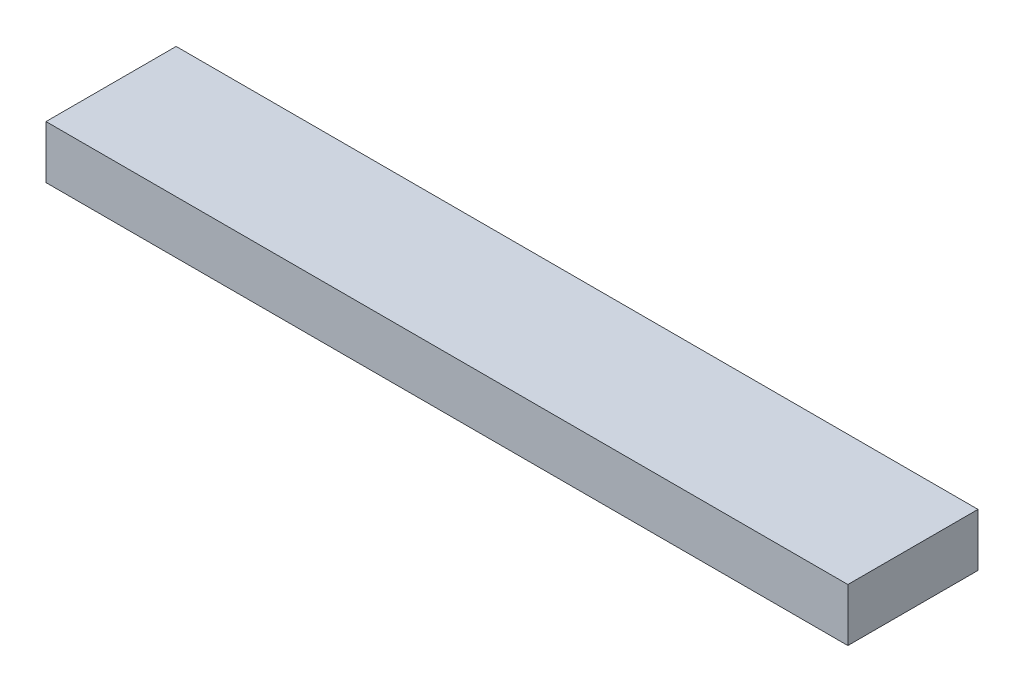
ISO-10303-21;
HEADER;
FILE_DESCRIPTION(('STEP AP214'),'2;1');
FILE_NAME('part.step','',(''),(''),'','','');
FILE_SCHEMA(('AUTOMOTIVE_DESIGN { 1 0 10303 214 1 1 1 1 }'));
ENDSEC;
DATA;
#1=APPLICATION_CONTEXT('core data for automotive mechanical design processes');
#2=APPLICATION_PROTOCOL_DEFINITION('international standard','automotive_design',2000,#1);
#3=PRODUCT_CONTEXT('',#1,'mechanical');
#4=PRODUCT('Part','Part','',(#3));
#5=PRODUCT_RELATED_PRODUCT_CATEGORY('part','',(#4));
#6=PRODUCT_DEFINITION_FORMATION('','',#4);
#7=PRODUCT_DEFINITION_CONTEXT('part definition',#1,'design');
#8=PRODUCT_DEFINITION('design','',#6,#7);
#9=PRODUCT_DEFINITION_SHAPE('','',#8);
#10=(LENGTH_UNIT() NAMED_UNIT(*) SI_UNIT(.MILLI.,.METRE.));
#11=(NAMED_UNIT(*) PLANE_ANGLE_UNIT() SI_UNIT($,.RADIAN.));
#12=(NAMED_UNIT(*) SI_UNIT($,.STERADIAN.) SOLID_ANGLE_UNIT());
#13=UNCERTAINTY_MEASURE_WITH_UNIT(LENGTH_MEASURE(1.E-05),#10,'distance_accuracy_value','');
#14=(GEOMETRIC_REPRESENTATION_CONTEXT(3) GLOBAL_UNCERTAINTY_ASSIGNED_CONTEXT((#13)) GLOBAL_UNIT_ASSIGNED_CONTEXT((#10,
#11,#12)) REPRESENTATION_CONTEXT('',''));
#15=CARTESIAN_POINT('',(0.,0.,0.));
#16=DIRECTION('',(0.,0.,1.));
#17=DIRECTION('',(1.,0.,0.));
#18=AXIS2_PLACEMENT_3D('',#15,#16,#17);
#19=CARTESIAN_POINT('',(23.875,-3.15,-3.875));
#20=DIRECTION('',(1.,0.,0.));
#21=DIRECTION('',(0.,0.,-1.));
#22=AXIS2_PLACEMENT_3D('',#19,#20,#21);
#23=PLANE('',#22);
#24=DIRECTION('',(0.,0.,-1.));
#25=VECTOR('',#24,1.);
#26=CARTESIAN_POINT('',(23.875,0.,-3.875));
#27=LINE('',#26,#25);
#28=CARTESIAN_POINT('',(23.875,0.,3.875));
#29=VERTEX_POINT('',#28);
#30=CARTESIAN_POINT('',(23.875,0.,-3.875));
#31=VERTEX_POINT('',#30);
#32=EDGE_CURVE('E118',#29,#31,#27,.T.);
#33=ORIENTED_EDGE('',*,*,#32,.F.);
#34=DIRECTION('',(0.,1.,0.));
#35=VECTOR('',#34,1.);
#36=CARTESIAN_POINT('',(23.875,-3.15,3.875));
#37=LINE('',#36,#35);
#38=CARTESIAN_POINT('',(23.875,-3.15,3.875));
#39=VERTEX_POINT('',#38);
#40=EDGE_CURVE('E58',#39,#29,#37,.T.);
#41=ORIENTED_EDGE('',*,*,#40,.F.);
#42=DIRECTION('',(0.,0.,-1.));
#43=VECTOR('',#42,1.);
#44=CARTESIAN_POINT('',(23.875,-3.15,-3.875));
#45=LINE('',#44,#43);
#46=CARTESIAN_POINT('',(23.875,-3.15,-3.875));
#47=VERTEX_POINT('',#46);
#48=EDGE_CURVE('E150',#39,#47,#45,.T.);
#49=ORIENTED_EDGE('',*,*,#48,.T.);
#50=DIRECTION('',(0.,1.,0.));
#51=VECTOR('',#50,1.);
#52=CARTESIAN_POINT('',(23.875,-3.15,-3.875));
#53=LINE('',#52,#51);
#54=EDGE_CURVE('E84',#47,#31,#53,.T.);
#55=ORIENTED_EDGE('',*,*,#54,.T.);
#56=EDGE_LOOP('',(#33,#41,#49,#55));
#57=FACE_BOUND('',#56,.T.);
#58=ADVANCED_FACE('F35',(#57),#23,.T.);
#59=CARTESIAN_POINT('',(-23.875,-3.15,3.875));
#60=DIRECTION('',(0.,0.,1.));
#61=DIRECTION('',(1.,0.,0.));
#62=AXIS2_PLACEMENT_3D('',#59,#60,#61);
#63=PLANE('',#62);
#64=DIRECTION('',(1.,0.,0.));
#65=VECTOR('',#64,1.);
#66=CARTESIAN_POINT('',(-23.875,0.,3.875));
#67=LINE('',#66,#65);
#68=CARTESIAN_POINT('',(-23.875,0.,3.875));
#69=VERTEX_POINT('',#68);
#70=EDGE_CURVE('E153',#69,#29,#67,.T.);
#71=ORIENTED_EDGE('',*,*,#70,.F.);
#72=DIRECTION('',(0.,1.,0.));
#73=VECTOR('',#72,1.);
#74=CARTESIAN_POINT('',(-23.875,-3.15,3.875));
#75=LINE('',#74,#73);
#76=CARTESIAN_POINT('',(-23.875,-3.15,3.875));
#77=VERTEX_POINT('',#76);
#78=EDGE_CURVE('E172',#77,#69,#75,.T.);
#79=ORIENTED_EDGE('',*,*,#78,.F.);
#80=DIRECTION('',(1.,0.,0.));
#81=VECTOR('',#80,1.);
#82=CARTESIAN_POINT('',(-23.875,-3.15,3.875));
#83=LINE('',#82,#81);
#84=EDGE_CURVE('E158',#77,#39,#83,.T.);
#85=ORIENTED_EDGE('',*,*,#84,.T.);
#86=ORIENTED_EDGE('',*,*,#40,.T.);
#87=EDGE_LOOP('',(#71,#79,#85,#86));
#88=FACE_BOUND('',#87,.T.);
#89=ADVANCED_FACE('F216',(#88),#63,.T.);
#90=CARTESIAN_POINT('',(-23.875,-3.15,-3.875));
#91=DIRECTION('',(-1.,0.,0.));
#92=DIRECTION('',(0.,0.,1.));
#93=AXIS2_PLACEMENT_3D('',#90,#91,#92);
#94=PLANE('',#93);
#95=DIRECTION('',(0.,0.,1.));
#96=VECTOR('',#95,1.);
#97=CARTESIAN_POINT('',(-23.875,0.,-3.875));
#98=LINE('',#97,#96);
#99=CARTESIAN_POINT('',(-23.875,0.,-3.875));
#100=VERTEX_POINT('',#99);
#101=EDGE_CURVE('E165',#100,#69,#98,.T.);
#102=ORIENTED_EDGE('',*,*,#101,.F.);
#103=DIRECTION('',(0.,1.,0.));
#104=VECTOR('',#103,1.);
#105=CARTESIAN_POINT('',(-23.875,-3.15,-3.875));
#106=LINE('',#105,#104);
#107=CARTESIAN_POINT('',(-23.875,-3.15,-3.875));
#108=VERTEX_POINT('',#107);
#109=EDGE_CURVE('E174',#108,#100,#106,.T.);
#110=ORIENTED_EDGE('',*,*,#109,.F.);
#111=DIRECTION('',(0.,0.,1.));
#112=VECTOR('',#111,1.);
#113=CARTESIAN_POINT('',(-23.875,-3.15,-3.875));
#114=LINE('',#113,#112);
#115=EDGE_CURVE('E155',#108,#77,#114,.T.);
#116=ORIENTED_EDGE('',*,*,#115,.T.);
#117=ORIENTED_EDGE('',*,*,#78,.T.);
#118=EDGE_LOOP('',(#102,#110,#116,#117));
#119=FACE_BOUND('',#118,.T.);
#120=ADVANCED_FACE('F220',(#119),#94,.T.);
#121=CARTESIAN_POINT('',(-23.875,-3.15,-3.875));
#122=DIRECTION('',(0.,0.,-1.));
#123=DIRECTION('',(-1.,0.,0.));
#124=AXIS2_PLACEMENT_3D('',#121,#122,#123);
#125=PLANE('',#124);
#126=DIRECTION('',(-1.,0.,0.));
#127=VECTOR('',#126,1.);
#128=CARTESIAN_POINT('',(-23.875,0.,-3.875));
#129=LINE('',#128,#127);
#130=EDGE_CURVE('E162',#31,#100,#129,.T.);
#131=ORIENTED_EDGE('',*,*,#130,.F.);
#132=ORIENTED_EDGE('',*,*,#54,.F.);
#133=DIRECTION('',(-1.,0.,0.));
#134=VECTOR('',#133,1.);
#135=CARTESIAN_POINT('',(-23.875,-3.15,-3.875));
#136=LINE('',#135,#134);
#137=EDGE_CURVE('E152',#47,#108,#136,.T.);
#138=ORIENTED_EDGE('',*,*,#137,.T.);
#139=ORIENTED_EDGE('',*,*,#109,.T.);
#140=EDGE_LOOP('',(#131,#132,#138,#139));
#141=FACE_BOUND('',#140,.T.);
#142=ADVANCED_FACE('F230',(#141),#125,.T.);
#143=CARTESIAN_POINT('',(0.,-3.15,0.));
#144=DIRECTION('',(0.,1.,0.));
#145=DIRECTION('',(0.,0.,1.));
#146=AXIS2_PLACEMENT_3D('',#143,#144,#145);
#147=PLANE('',#146);
#148=DIRECTION('',(1.,0.,0.));
#149=VECTOR('',#148,1.);
#150=CARTESIAN_POINT('',(0.,-3.15,2.375));
#151=LINE('',#150,#149);
#152=CARTESIAN_POINT('',(-22.375,-3.15,2.375));
#153=VERTEX_POINT('',#152);
#154=CARTESIAN_POINT('',(22.375,-3.15,2.375));
#155=VERTEX_POINT('',#154);
#156=EDGE_CURVE('E145',#153,#155,#151,.T.);
#157=ORIENTED_EDGE('',*,*,#156,.T.);
#158=DIRECTION('',(0.,0.,-1.));
#159=VECTOR('',#158,1.);
#160=CARTESIAN_POINT('',(22.375,-3.15,0.));
#161=LINE('',#160,#159);
#162=CARTESIAN_POINT('',(22.375,-3.15,-2.375));
#163=VERTEX_POINT('',#162);
#164=EDGE_CURVE('E113',#155,#163,#161,.T.);
#165=ORIENTED_EDGE('',*,*,#164,.T.);
#166=DIRECTION('',(-1.,0.,0.));
#167=VECTOR('',#166,1.);
#168=CARTESIAN_POINT('',(0.,-3.15,-2.375));
#169=LINE('',#168,#167);
#170=CARTESIAN_POINT('',(-22.375,-3.15,-2.375));
#171=VERTEX_POINT('',#170);
#172=EDGE_CURVE('E135',#163,#171,#169,.T.);
#173=ORIENTED_EDGE('',*,*,#172,.T.);
#174=DIRECTION('',(0.,0.,1.));
#175=VECTOR('',#174,1.);
#176=CARTESIAN_POINT('',(-22.375,-3.15,0.));
#177=LINE('',#176,#175);
#178=EDGE_CURVE('E49',#171,#153,#177,.T.);
#179=ORIENTED_EDGE('',*,*,#178,.T.);
#180=EDGE_LOOP('',(#157,#165,#173,#179));
#181=FACE_BOUND('',#180,.T.);
#182=ORIENTED_EDGE('',*,*,#48,.F.);
#183=ORIENTED_EDGE('',*,*,#84,.F.);
#184=ORIENTED_EDGE('',*,*,#115,.F.);
#185=ORIENTED_EDGE('',*,*,#137,.F.);
#186=EDGE_LOOP('',(#182,#183,#184,#185));
#187=FACE_BOUND('',#186,.T.);
#188=ADVANCED_FACE('F229',(#181,#187),#147,.F.);
#189=CARTESIAN_POINT('',(0.,0.,0.));
#190=DIRECTION('',(0.,1.,0.));
#191=DIRECTION('',(0.,0.,1.));
#192=AXIS2_PLACEMENT_3D('',#189,#190,#191);
#193=PLANE('',#192);
#194=ORIENTED_EDGE('',*,*,#32,.T.);
#195=ORIENTED_EDGE('',*,*,#130,.T.);
#196=ORIENTED_EDGE('',*,*,#101,.T.);
#197=ORIENTED_EDGE('',*,*,#70,.T.);
#198=EDGE_LOOP('',(#194,#195,#196,#197));
#199=FACE_BOUND('',#198,.T.);
#200=ADVANCED_FACE('F223',(#199),#193,.T.);
#201=CARTESIAN_POINT('',(22.375,-3.15,-3.875));
#202=DIRECTION('',(1.,0.,0.));
#203=DIRECTION('',(0.,0.,-1.));
#204=AXIS2_PLACEMENT_3D('',#201,#202,#203);
#205=PLANE('',#204);
#206=DIRECTION('',(0.,0.,-1.));
#207=VECTOR('',#206,1.);
#208=CARTESIAN_POINT('',(22.375,-1.5,0.));
#209=LINE('',#208,#207);
#210=CARTESIAN_POINT('',(22.375,-1.5,2.375));
#211=VERTEX_POINT('',#210);
#212=CARTESIAN_POINT('',(22.375,-1.5,-2.375));
#213=VERTEX_POINT('',#212);
#214=EDGE_CURVE('E111',#211,#213,#209,.T.);
#215=ORIENTED_EDGE('',*,*,#214,.T.);
#216=DIRECTION('',(0.,1.,0.));
#217=VECTOR('',#216,1.);
#218=CARTESIAN_POINT('',(22.375,-3.15,-2.375));
#219=LINE('',#218,#217);
#220=EDGE_CURVE('E140',#163,#213,#219,.T.);
#221=ORIENTED_EDGE('',*,*,#220,.F.);
#222=ORIENTED_EDGE('',*,*,#164,.F.);
#223=DIRECTION('',(0.,1.,0.));
#224=VECTOR('',#223,1.);
#225=CARTESIAN_POINT('',(22.375,-3.15,2.375));
#226=LINE('',#225,#224);
#227=EDGE_CURVE('E108',#155,#211,#226,.T.);
#228=ORIENTED_EDGE('',*,*,#227,.T.);
#229=EDGE_LOOP('',(#215,#221,#222,#228));
#230=FACE_BOUND('',#229,.T.);
#231=ADVANCED_FACE('F110',(#230),#205,.F.);
#232=CARTESIAN_POINT('',(-23.875,-3.15,2.375));
#233=DIRECTION('',(0.,0.,1.));
#234=DIRECTION('',(1.,0.,0.));
#235=AXIS2_PLACEMENT_3D('',#232,#233,#234);
#236=PLANE('',#235);
#237=DIRECTION('',(1.,0.,0.));
#238=VECTOR('',#237,1.);
#239=CARTESIAN_POINT('',(0.,-1.5,2.375));
#240=LINE('',#239,#238);
#241=CARTESIAN_POINT('',(-22.375,-1.5,2.375));
#242=VERTEX_POINT('',#241);
#243=EDGE_CURVE('E126',#242,#211,#240,.T.);
#244=ORIENTED_EDGE('',*,*,#243,.T.);
#245=ORIENTED_EDGE('',*,*,#227,.F.);
#246=ORIENTED_EDGE('',*,*,#156,.F.);
#247=DIRECTION('',(0.,1.,0.));
#248=VECTOR('',#247,1.);
#249=CARTESIAN_POINT('',(-22.375,-3.15,2.375));
#250=LINE('',#249,#248);
#251=EDGE_CURVE('E119',#153,#242,#250,.T.);
#252=ORIENTED_EDGE('',*,*,#251,.T.);
#253=EDGE_LOOP('',(#244,#245,#246,#252));
#254=FACE_BOUND('',#253,.T.);
#255=ADVANCED_FACE('F131',(#254),#236,.F.);
#256=CARTESIAN_POINT('',(-22.375,-3.15,-3.875));
#257=DIRECTION('',(-1.,0.,0.));
#258=DIRECTION('',(0.,0.,1.));
#259=AXIS2_PLACEMENT_3D('',#256,#257,#258);
#260=PLANE('',#259);
#261=DIRECTION('',(0.,0.,1.));
#262=VECTOR('',#261,1.);
#263=CARTESIAN_POINT('',(-22.375,-1.5,0.));
#264=LINE('',#263,#262);
#265=CARTESIAN_POINT('',(-22.375,-1.5,-2.375));
#266=VERTEX_POINT('',#265);
#267=EDGE_CURVE('E133',#266,#242,#264,.T.);
#268=ORIENTED_EDGE('',*,*,#267,.T.);
#269=ORIENTED_EDGE('',*,*,#251,.F.);
#270=ORIENTED_EDGE('',*,*,#178,.F.);
#271=DIRECTION('',(0.,1.,0.));
#272=VECTOR('',#271,1.);
#273=CARTESIAN_POINT('',(-22.375,-3.15,-2.375));
#274=LINE('',#273,#272);
#275=EDGE_CURVE('E141',#171,#266,#274,.T.);
#276=ORIENTED_EDGE('',*,*,#275,.T.);
#277=EDGE_LOOP('',(#268,#269,#270,#276));
#278=FACE_BOUND('',#277,.T.);
#279=ADVANCED_FACE('F244',(#278),#260,.F.);
#280=CARTESIAN_POINT('',(-23.875,-3.15,-2.375));
#281=DIRECTION('',(0.,0.,-1.));
#282=DIRECTION('',(-1.,0.,0.));
#283=AXIS2_PLACEMENT_3D('',#280,#281,#282);
#284=PLANE('',#283);
#285=DIRECTION('',(-1.,0.,0.));
#286=VECTOR('',#285,1.);
#287=CARTESIAN_POINT('',(0.,-1.5,-2.375));
#288=LINE('',#287,#286);
#289=EDGE_CURVE('E128',#213,#266,#288,.T.);
#290=ORIENTED_EDGE('',*,*,#289,.T.);
#291=ORIENTED_EDGE('',*,*,#275,.F.);
#292=ORIENTED_EDGE('',*,*,#172,.F.);
#293=ORIENTED_EDGE('',*,*,#220,.T.);
#294=EDGE_LOOP('',(#290,#291,#292,#293));
#295=FACE_BOUND('',#294,.T.);
#296=ADVANCED_FACE('F192',(#295),#284,.F.);
#297=CARTESIAN_POINT('',(0.,-1.5,0.));
#298=DIRECTION('',(0.,1.,0.));
#299=DIRECTION('',(0.,0.,1.));
#300=AXIS2_PLACEMENT_3D('',#297,#298,#299);
#301=PLANE('',#300);
#302=CARTESIAN_POINT('',(15.875,-1.5,0.));
#303=DIRECTION('',(0.,1.,0.));
#304=DIRECTION('',(0.,0.,1.));
#305=AXIS2_PLACEMENT_3D('',#302,#303,#304);
#306=CIRCLE('',#305,1.5);
#307=CARTESIAN_POINT('',(15.875,-1.5,1.5));
#308=VERTEX_POINT('',#307);
#309=EDGE_CURVE('E12',#308,#308,#306,.F.);
#310=ORIENTED_EDGE('',*,*,#309,.F.);
#311=EDGE_LOOP('',(#310));
#312=FACE_BOUND('',#311,.T.);
#313=CARTESIAN_POINT('',(7.91666666666667,-1.5,0.));
#314=DIRECTION('',(0.,1.,0.));
#315=DIRECTION('',(0.,0.,1.));
#316=AXIS2_PLACEMENT_3D('',#313,#314,#315);
#317=CIRCLE('',#316,1.5);
#318=CARTESIAN_POINT('',(7.91666666666667,-1.5,1.5));
#319=VERTEX_POINT('',#318);
#320=EDGE_CURVE('E42',#319,#319,#317,.F.);
#321=ORIENTED_EDGE('',*,*,#320,.F.);
#322=EDGE_LOOP('',(#321));
#323=FACE_BOUND('',#322,.T.);
#324=CARTESIAN_POINT('',(-0.0416666666666655,-1.5,0.));
#325=DIRECTION('',(0.,1.,0.));
#326=DIRECTION('',(0.,0.,1.));
#327=AXIS2_PLACEMENT_3D('',#324,#325,#326);
#328=CIRCLE('',#327,1.5);
#329=CARTESIAN_POINT('',(-0.0416666666666655,-1.5,1.5));
#330=VERTEX_POINT('',#329);
#331=EDGE_CURVE('E182',#330,#330,#328,.F.);
#332=ORIENTED_EDGE('',*,*,#331,.F.);
#333=EDGE_LOOP('',(#332));
#334=FACE_BOUND('',#333,.T.);
#335=CARTESIAN_POINT('',(-8.,-1.5,0.));
#336=DIRECTION('',(0.,1.,0.));
#337=DIRECTION('',(0.,0.,1.));
#338=AXIS2_PLACEMENT_3D('',#335,#336,#337);
#339=CIRCLE('',#338,1.5);
#340=CARTESIAN_POINT('',(-8.,-1.5,1.5));
#341=VERTEX_POINT('',#340);
#342=EDGE_CURVE('E179',#341,#341,#339,.F.);
#343=ORIENTED_EDGE('',*,*,#342,.F.);
#344=EDGE_LOOP('',(#343));
#345=FACE_BOUND('',#344,.T.);
#346=CARTESIAN_POINT('',(-15.9583333333333,-1.5,0.));
#347=DIRECTION('',(0.,1.,0.));
#348=DIRECTION('',(0.,0.,1.));
#349=AXIS2_PLACEMENT_3D('',#346,#347,#348);
#350=CIRCLE('',#349,1.5);
#351=CARTESIAN_POINT('',(-15.9583333333333,-1.5,1.5));
#352=VERTEX_POINT('',#351);
#353=EDGE_CURVE('E171',#352,#352,#350,.F.);
#354=ORIENTED_EDGE('',*,*,#353,.F.);
#355=EDGE_LOOP('',(#354));
#356=FACE_BOUND('',#355,.T.);
#357=ORIENTED_EDGE('',*,*,#214,.F.);
#358=ORIENTED_EDGE('',*,*,#243,.F.);
#359=ORIENTED_EDGE('',*,*,#267,.F.);
#360=ORIENTED_EDGE('',*,*,#289,.F.);
#361=EDGE_LOOP('',(#357,#358,#359,#360));
#362=FACE_BOUND('',#361,.T.);
#363=ADVANCED_FACE('F124',(#312,#323,#334,#345,#356,#362),#301,.F.);
#364=CARTESIAN_POINT('',(-15.9583333333333,-7.39264068711929,0.));
#365=DIRECTION('',(0.,1.,0.));
#366=DIRECTION('',(0.,0.,1.));
#367=AXIS2_PLACEMENT_3D('',#364,#365,#366);
#368=CYLINDRICAL_SURFACE('',#367,1.5);
#369=CARTESIAN_POINT('',(-15.9583333333333,-2.95,0.));
#370=DIRECTION('',(0.,1.,0.));
#371=DIRECTION('',(0.,0.,1.));
#372=AXIS2_PLACEMENT_3D('',#369,#370,#371);
#373=CIRCLE('',#372,1.5);
#374=CARTESIAN_POINT('',(-15.9583333333333,-2.95,1.5));
#375=VERTEX_POINT('',#374);
#376=EDGE_CURVE('E264',#375,#375,#373,.T.);
#377=ORIENTED_EDGE('',*,*,#376,.T.);
#378=EDGE_LOOP('',(#377));
#379=FACE_BOUND('',#378,.T.);
#380=ORIENTED_EDGE('',*,*,#353,.T.);
#381=EDGE_LOOP('',(#380));
#382=FACE_BOUND('',#381,.T.);
#383=ADVANCED_FACE('F191',(#379,#382),#368,.T.);
#384=CARTESIAN_POINT('',(-15.9583333333333,-7.39264068711929,0.));
#385=DIRECTION('',(0.,1.,0.));
#386=DIRECTION('',(0.,0.,1.));
#387=AXIS2_PLACEMENT_3D('',#384,#385,#386);
#388=CYLINDRICAL_SURFACE('',#387,0.7);
#389=CARTESIAN_POINT('',(-15.9583333333333,-2.95,0.));
#390=DIRECTION('',(0.,1.,0.));
#391=DIRECTION('',(0.,0.,1.));
#392=AXIS2_PLACEMENT_3D('',#389,#390,#391);
#393=CIRCLE('',#392,0.7);
#394=CARTESIAN_POINT('',(-15.9583333333333,-2.95,0.7));
#395=VERTEX_POINT('',#394);
#396=EDGE_CURVE('E129',#395,#395,#393,.T.);
#397=ORIENTED_EDGE('',*,*,#396,.F.);
#398=EDGE_LOOP('',(#397));
#399=FACE_BOUND('',#398,.T.);
#400=CARTESIAN_POINT('',(-15.9583333333333,-1.5,0.));
#401=DIRECTION('',(0.,-1.,0.));
#402=DIRECTION('',(0.,0.,-1.));
#403=AXIS2_PLACEMENT_3D('',#400,#401,#402);
#404=CIRCLE('',#403,0.7);
#405=CARTESIAN_POINT('',(-15.9583333333333,-1.5,-0.7));
#406=VERTEX_POINT('',#405);
#407=EDGE_CURVE('E265',#406,#406,#404,.T.);
#408=ORIENTED_EDGE('',*,*,#407,.F.);
#409=EDGE_LOOP('',(#408));
#410=FACE_BOUND('',#409,.T.);
#411=ADVANCED_FACE('F204',(#399,#410),#388,.F.);
#412=CARTESIAN_POINT('',(0.,-2.95,0.));
#413=DIRECTION('',(0.,1.,0.));
#414=DIRECTION('',(0.,0.,1.));
#415=AXIS2_PLACEMENT_3D('',#412,#413,#414);
#416=PLANE('',#415);
#417=ORIENTED_EDGE('',*,*,#396,.T.);
#418=EDGE_LOOP('',(#417));
#419=FACE_BOUND('',#418,.T.);
#420=ORIENTED_EDGE('',*,*,#376,.F.);
#421=EDGE_LOOP('',(#420));
#422=FACE_BOUND('',#421,.T.);
#423=ADVANCED_FACE('F210',(#419,#422),#416,.F.);
#424=ORIENTED_EDGE('',*,*,#407,.T.);
#425=EDGE_LOOP('',(#424));
#426=FACE_BOUND('',#425,.T.);
#427=ADVANCED_FACE('F196',(#426),#301,.F.);
#428=CARTESIAN_POINT('',(-8.,-7.39264068711929,0.));
#429=DIRECTION('',(0.,1.,0.));
#430=DIRECTION('',(0.,0.,1.));
#431=AXIS2_PLACEMENT_3D('',#428,#429,#430);
#432=CYLINDRICAL_SURFACE('',#431,1.5);
#433=CARTESIAN_POINT('',(-8.,-2.95,0.));
#434=DIRECTION('',(0.,1.,0.));
#435=DIRECTION('',(0.,0.,1.));
#436=AXIS2_PLACEMENT_3D('',#433,#434,#435);
#437=CIRCLE('',#436,1.5);
#438=CARTESIAN_POINT('',(-8.,-2.95,1.5));
#439=VERTEX_POINT('',#438);
#440=EDGE_CURVE('E274',#439,#439,#437,.T.);
#441=ORIENTED_EDGE('',*,*,#440,.T.);
#442=EDGE_LOOP('',(#441));
#443=FACE_BOUND('',#442,.T.);
#444=ORIENTED_EDGE('',*,*,#342,.T.);
#445=EDGE_LOOP('',(#444));
#446=FACE_BOUND('',#445,.T.);
#447=ADVANCED_FACE('F257',(#443,#446),#432,.T.);
#448=CARTESIAN_POINT('',(-8.,-7.39264068711929,0.));
#449=DIRECTION('',(0.,1.,0.));
#450=DIRECTION('',(0.,0.,1.));
#451=AXIS2_PLACEMENT_3D('',#448,#449,#450);
#452=CYLINDRICAL_SURFACE('',#451,0.7);
#453=CARTESIAN_POINT('',(-8.,-2.95,0.));
#454=DIRECTION('',(0.,1.,0.));
#455=DIRECTION('',(0.,0.,1.));
#456=AXIS2_PLACEMENT_3D('',#453,#454,#455);
#457=CIRCLE('',#456,0.7);
#458=CARTESIAN_POINT('',(-8.,-2.95,0.7));
#459=VERTEX_POINT('',#458);
#460=EDGE_CURVE('E269',#459,#459,#457,.T.);
#461=ORIENTED_EDGE('',*,*,#460,.F.);
#462=EDGE_LOOP('',(#461));
#463=FACE_BOUND('',#462,.T.);
#464=CARTESIAN_POINT('',(-8.,-1.5,0.));
#465=DIRECTION('',(0.,-1.,0.));
#466=DIRECTION('',(0.,0.,-1.));
#467=AXIS2_PLACEMENT_3D('',#464,#465,#466);
#468=CIRCLE('',#467,0.7);
#469=CARTESIAN_POINT('',(-8.,-1.5,-0.7));
#470=VERTEX_POINT('',#469);
#471=EDGE_CURVE('E277',#470,#470,#468,.T.);
#472=ORIENTED_EDGE('',*,*,#471,.F.);
#473=EDGE_LOOP('',(#472));
#474=FACE_BOUND('',#473,.T.);
#475=ADVANCED_FACE('F352',(#463,#474),#452,.F.);
#476=CARTESIAN_POINT('',(0.,-2.95,0.));
#477=DIRECTION('',(0.,1.,0.));
#478=DIRECTION('',(0.,0.,1.));
#479=AXIS2_PLACEMENT_3D('',#476,#477,#478);
#480=PLANE('',#479);
#481=ORIENTED_EDGE('',*,*,#460,.T.);
#482=EDGE_LOOP('',(#481));
#483=FACE_BOUND('',#482,.T.);
#484=ORIENTED_EDGE('',*,*,#440,.F.);
#485=EDGE_LOOP('',(#484));
#486=FACE_BOUND('',#485,.T.);
#487=ADVANCED_FACE('F355',(#483,#486),#480,.F.);
#488=ORIENTED_EDGE('',*,*,#471,.T.);
#489=EDGE_LOOP('',(#488));
#490=FACE_BOUND('',#489,.T.);
#491=ADVANCED_FACE('F259',(#490),#301,.F.);
#492=CARTESIAN_POINT('',(-0.0416666666666655,-7.39264068711929,0.));
#493=DIRECTION('',(0.,1.,0.));
#494=DIRECTION('',(0.,0.,1.));
#495=AXIS2_PLACEMENT_3D('',#492,#493,#494);
#496=CYLINDRICAL_SURFACE('',#495,1.5);
#497=CARTESIAN_POINT('',(-0.0416666666666655,-2.95,0.));
#498=DIRECTION('',(0.,1.,0.));
#499=DIRECTION('',(0.,0.,1.));
#500=AXIS2_PLACEMENT_3D('',#497,#498,#499);
#501=CIRCLE('',#500,1.5);
#502=CARTESIAN_POINT('',(-0.0416666666666655,-2.95,1.5));
#503=VERTEX_POINT('',#502);
#504=EDGE_CURVE('E283',#503,#503,#501,.T.);
#505=ORIENTED_EDGE('',*,*,#504,.T.);
#506=EDGE_LOOP('',(#505));
#507=FACE_BOUND('',#506,.T.);
#508=ORIENTED_EDGE('',*,*,#331,.T.);
#509=EDGE_LOOP('',(#508));
#510=FACE_BOUND('',#509,.T.);
#511=ADVANCED_FACE('F338',(#507,#510),#496,.T.);
#512=CARTESIAN_POINT('',(-0.0416666666666655,-7.39264068711929,0.));
#513=DIRECTION('',(0.,1.,0.));
#514=DIRECTION('',(0.,0.,1.));
#515=AXIS2_PLACEMENT_3D('',#512,#513,#514);
#516=CYLINDRICAL_SURFACE('',#515,0.7);
#517=CARTESIAN_POINT('',(-0.0416666666666655,-2.95,0.));
#518=DIRECTION('',(0.,1.,0.));
#519=DIRECTION('',(0.,0.,1.));
#520=AXIS2_PLACEMENT_3D('',#517,#518,#519);
#521=CIRCLE('',#520,0.7);
#522=CARTESIAN_POINT('',(-0.0416666666666655,-2.95,0.7));
#523=VERTEX_POINT('',#522);
#524=EDGE_CURVE('E280',#523,#523,#521,.T.);
#525=ORIENTED_EDGE('',*,*,#524,.F.);
#526=EDGE_LOOP('',(#525));
#527=FACE_BOUND('',#526,.T.);
#528=CARTESIAN_POINT('',(-0.0416666666666655,-1.5,0.));
#529=DIRECTION('',(0.,-1.,0.));
#530=DIRECTION('',(0.,0.,-1.));
#531=AXIS2_PLACEMENT_3D('',#528,#529,#530);
#532=CIRCLE('',#531,0.7);
#533=CARTESIAN_POINT('',(-0.0416666666666655,-1.5,-0.7));
#534=VERTEX_POINT('',#533);
#535=EDGE_CURVE('E286',#534,#534,#532,.T.);
#536=ORIENTED_EDGE('',*,*,#535,.F.);
#537=EDGE_LOOP('',(#536));
#538=FACE_BOUND('',#537,.T.);
#539=ADVANCED_FACE('F341',(#527,#538),#516,.F.);
#540=CARTESIAN_POINT('',(0.,-2.95,0.));
#541=DIRECTION('',(0.,1.,0.));
#542=DIRECTION('',(0.,0.,1.));
#543=AXIS2_PLACEMENT_3D('',#540,#541,#542);
#544=PLANE('',#543);
#545=ORIENTED_EDGE('',*,*,#524,.T.);
#546=EDGE_LOOP('',(#545));
#547=FACE_BOUND('',#546,.T.);
#548=ORIENTED_EDGE('',*,*,#504,.F.);
#549=EDGE_LOOP('',(#548));
#550=FACE_BOUND('',#549,.T.);
#551=ADVANCED_FACE('F345',(#547,#550),#544,.F.);
#552=ORIENTED_EDGE('',*,*,#535,.T.);
#553=EDGE_LOOP('',(#552));
#554=FACE_BOUND('',#553,.T.);
#555=ADVANCED_FACE('F329',(#554),#301,.F.);
#556=CARTESIAN_POINT('',(7.91666666666667,-7.39264068711929,0.));
#557=DIRECTION('',(0.,1.,0.));
#558=DIRECTION('',(0.,0.,1.));
#559=AXIS2_PLACEMENT_3D('',#556,#557,#558);
#560=CYLINDRICAL_SURFACE('',#559,1.5);
#561=CARTESIAN_POINT('',(7.91666666666667,-2.95,0.));
#562=DIRECTION('',(0.,1.,0.));
#563=DIRECTION('',(0.,0.,1.));
#564=AXIS2_PLACEMENT_3D('',#561,#562,#563);
#565=CIRCLE('',#564,1.5);
#566=CARTESIAN_POINT('',(7.91666666666667,-2.95,1.5));
#567=VERTEX_POINT('',#566);
#568=EDGE_CURVE('E292',#567,#567,#565,.T.);
#569=ORIENTED_EDGE('',*,*,#568,.T.);
#570=EDGE_LOOP('',(#569));
#571=FACE_BOUND('',#570,.T.);
#572=ORIENTED_EDGE('',*,*,#320,.T.);
#573=EDGE_LOOP('',(#572));
#574=FACE_BOUND('',#573,.T.);
#575=ADVANCED_FACE('F187',(#571,#574),#560,.T.);
#576=CARTESIAN_POINT('',(7.91666666666667,-7.39264068711929,0.));
#577=DIRECTION('',(0.,1.,0.));
#578=DIRECTION('',(0.,0.,1.));
#579=AXIS2_PLACEMENT_3D('',#576,#577,#578);
#580=CYLINDRICAL_SURFACE('',#579,0.7);
#581=CARTESIAN_POINT('',(7.91666666666667,-2.95,0.));
#582=DIRECTION('',(0.,1.,0.));
#583=DIRECTION('',(0.,0.,1.));
#584=AXIS2_PLACEMENT_3D('',#581,#582,#583);
#585=CIRCLE('',#584,0.7);
#586=CARTESIAN_POINT('',(7.91666666666667,-2.95,0.7));
#587=VERTEX_POINT('',#586);
#588=EDGE_CURVE('E289',#587,#587,#585,.T.);
#589=ORIENTED_EDGE('',*,*,#588,.F.);
#590=EDGE_LOOP('',(#589));
#591=FACE_BOUND('',#590,.T.);
#592=CARTESIAN_POINT('',(7.91666666666667,-1.5,0.));
#593=DIRECTION('',(0.,-1.,0.));
#594=DIRECTION('',(0.,0.,-1.));
#595=AXIS2_PLACEMENT_3D('',#592,#593,#594);
#596=CIRCLE('',#595,0.7);
#597=CARTESIAN_POINT('',(7.91666666666667,-1.5,-0.7));
#598=VERTEX_POINT('',#597);
#599=EDGE_CURVE('E295',#598,#598,#596,.T.);
#600=ORIENTED_EDGE('',*,*,#599,.F.);
#601=EDGE_LOOP('',(#600));
#602=FACE_BOUND('',#601,.T.);
#603=ADVANCED_FACE('F328',(#591,#602),#580,.F.);
#604=CARTESIAN_POINT('',(0.,-2.95,0.));
#605=DIRECTION('',(0.,1.,0.));
#606=DIRECTION('',(0.,0.,1.));
#607=AXIS2_PLACEMENT_3D('',#604,#605,#606);
#608=PLANE('',#607);
#609=ORIENTED_EDGE('',*,*,#588,.T.);
#610=EDGE_LOOP('',(#609));
#611=FACE_BOUND('',#610,.T.);
#612=ORIENTED_EDGE('',*,*,#568,.F.);
#613=EDGE_LOOP('',(#612));
#614=FACE_BOUND('',#613,.T.);
#615=ADVANCED_FACE('F333',(#611,#614),#608,.F.);
#616=ORIENTED_EDGE('',*,*,#599,.T.);
#617=EDGE_LOOP('',(#616));
#618=FACE_BOUND('',#617,.T.);
#619=ADVANCED_FACE('F321',(#618),#301,.F.);
#620=CARTESIAN_POINT('',(15.875,-7.39264068711929,0.));
#621=DIRECTION('',(0.,1.,0.));
#622=DIRECTION('',(0.,0.,1.));
#623=AXIS2_PLACEMENT_3D('',#620,#621,#622);
#624=CYLINDRICAL_SURFACE('',#623,1.5);
#625=CARTESIAN_POINT('',(15.875,-2.95,0.));
#626=DIRECTION('',(0.,1.,0.));
#627=DIRECTION('',(0.,0.,1.));
#628=AXIS2_PLACEMENT_3D('',#625,#626,#627);
#629=CIRCLE('',#628,1.5);
#630=CARTESIAN_POINT('',(15.875,-2.95,1.5));
#631=VERTEX_POINT('',#630);
#632=EDGE_CURVE('E301',#631,#631,#629,.T.);
#633=ORIENTED_EDGE('',*,*,#632,.T.);
#634=EDGE_LOOP('',(#633));
#635=FACE_BOUND('',#634,.T.);
#636=ORIENTED_EDGE('',*,*,#309,.T.);
#637=EDGE_LOOP('',(#636));
#638=FACE_BOUND('',#637,.T.);
#639=ADVANCED_FACE('F312',(#635,#638),#624,.T.);
#640=CARTESIAN_POINT('',(15.875,-7.39264068711929,0.));
#641=DIRECTION('',(0.,1.,0.));
#642=DIRECTION('',(0.,0.,1.));
#643=AXIS2_PLACEMENT_3D('',#640,#641,#642);
#644=CYLINDRICAL_SURFACE('',#643,0.699999999999998);
#645=CARTESIAN_POINT('',(15.875,-2.95,0.));
#646=DIRECTION('',(0.,1.,0.));
#647=DIRECTION('',(0.,0.,1.));
#648=AXIS2_PLACEMENT_3D('',#645,#646,#647);
#649=CIRCLE('',#648,0.699999999999998);
#650=CARTESIAN_POINT('',(15.875,-2.95,0.699999999999998));
#651=VERTEX_POINT('',#650);
#652=EDGE_CURVE('E298',#651,#651,#649,.T.);
#653=ORIENTED_EDGE('',*,*,#652,.F.);
#654=EDGE_LOOP('',(#653));
#655=FACE_BOUND('',#654,.T.);
#656=CARTESIAN_POINT('',(15.875,-1.5,0.));
#657=DIRECTION('',(0.,-1.,0.));
#658=DIRECTION('',(0.,0.,-1.));
#659=AXIS2_PLACEMENT_3D('',#656,#657,#658);
#660=CIRCLE('',#659,0.699999999999998);
#661=CARTESIAN_POINT('',(15.875,-1.5,-0.699999999999998));
#662=VERTEX_POINT('',#661);
#663=EDGE_CURVE('E304',#662,#662,#660,.T.);
#664=ORIENTED_EDGE('',*,*,#663,.F.);
#665=EDGE_LOOP('',(#664));
#666=FACE_BOUND('',#665,.T.);
#667=ADVANCED_FACE('F309',(#655,#666),#644,.F.);
#668=CARTESIAN_POINT('',(0.,-2.95,0.));
#669=DIRECTION('',(0.,1.,0.));
#670=DIRECTION('',(0.,0.,1.));
#671=AXIS2_PLACEMENT_3D('',#668,#669,#670);
#672=PLANE('',#671);
#673=ORIENTED_EDGE('',*,*,#652,.T.);
#674=EDGE_LOOP('',(#673));
#675=FACE_BOUND('',#674,.T.);
#676=ORIENTED_EDGE('',*,*,#632,.F.);
#677=EDGE_LOOP('',(#676));
#678=FACE_BOUND('',#677,.T.);
#679=ADVANCED_FACE('F311',(#675,#678),#672,.F.);
#680=ORIENTED_EDGE('',*,*,#663,.T.);
#681=EDGE_LOOP('',(#680));
#682=FACE_BOUND('',#681,.T.);
#683=ADVANCED_FACE('F195',(#682),#301,.F.);
#684=CLOSED_SHELL('',(#58,#89,#120,#142,#188,#200,#231,#255,#279,#296,#363,#383,#411,#423,#427,
#447,#475,#487,#491,#511,#539,#551,#555,#575,#603,#615,#619,#639,#667,#679,#683));
#685=MANIFOLD_SOLID_BREP('B2',#684);
#686=ADVANCED_BREP_SHAPE_REPRESENTATION('',(#18,#685),#14);
#687=SHAPE_DEFINITION_REPRESENTATION(#9,#686);
ENDSEC;
END-ISO-10303-21;
